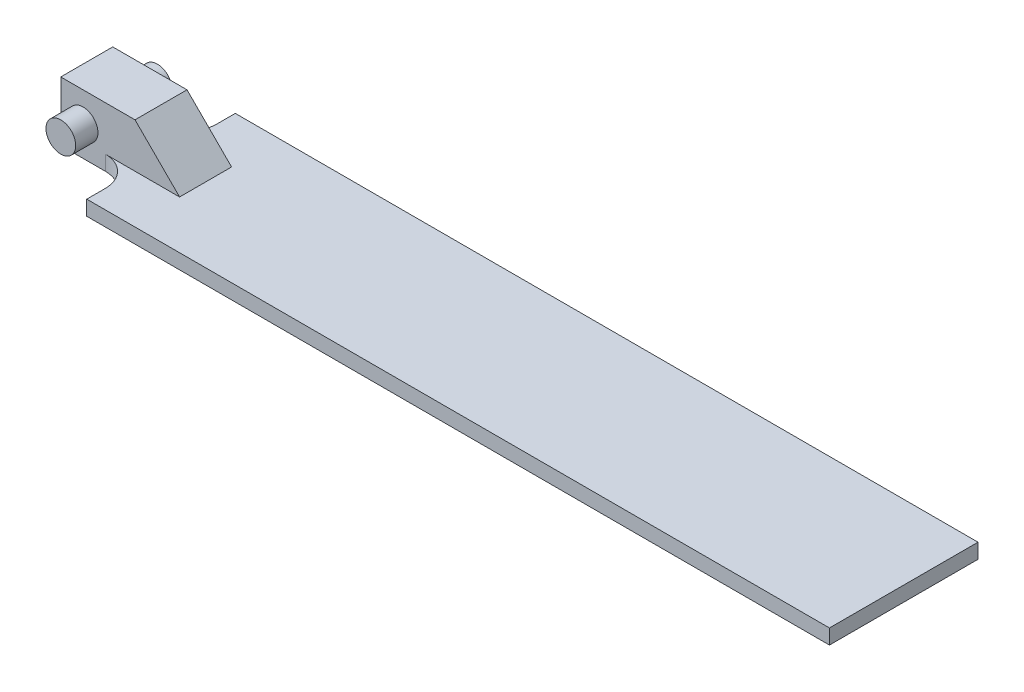
ISO-10303-21;
HEADER;
FILE_DESCRIPTION(('STEP AP214'),'2;1');
FILE_NAME('part.step','',(''),(''),'','','');
FILE_SCHEMA(('AUTOMOTIVE_DESIGN { 1 0 10303 214 1 1 1 1 }'));
ENDSEC;
DATA;
#1=APPLICATION_CONTEXT('core data for automotive mechanical design processes');
#2=APPLICATION_PROTOCOL_DEFINITION('international standard','automotive_design',2000,#1);
#3=PRODUCT_CONTEXT('',#1,'mechanical');
#4=PRODUCT('Part','Part','',(#3));
#5=PRODUCT_RELATED_PRODUCT_CATEGORY('part','',(#4));
#6=PRODUCT_DEFINITION_FORMATION('','',#4);
#7=PRODUCT_DEFINITION_CONTEXT('part definition',#1,'design');
#8=PRODUCT_DEFINITION('design','',#6,#7);
#9=PRODUCT_DEFINITION_SHAPE('','',#8);
#10=(LENGTH_UNIT() NAMED_UNIT(*) SI_UNIT(.MILLI.,.METRE.));
#11=(NAMED_UNIT(*) PLANE_ANGLE_UNIT() SI_UNIT($,.RADIAN.));
#12=(NAMED_UNIT(*) SI_UNIT($,.STERADIAN.) SOLID_ANGLE_UNIT());
#13=UNCERTAINTY_MEASURE_WITH_UNIT(LENGTH_MEASURE(1.E-05),#10,'distance_accuracy_value','');
#14=(GEOMETRIC_REPRESENTATION_CONTEXT(3) GLOBAL_UNCERTAINTY_ASSIGNED_CONTEXT((#13)) GLOBAL_UNIT_ASSIGNED_CONTEXT((#10,
#11,#12)) REPRESENTATION_CONTEXT('',''));
#15=CARTESIAN_POINT('',(0.,0.,0.));
#16=DIRECTION('',(0.,0.,1.));
#17=DIRECTION('',(1.,0.,0.));
#18=AXIS2_PLACEMENT_3D('',#15,#16,#17);
#19=CARTESIAN_POINT('',(0.,8.,3.5));
#20=DIRECTION('',(1.,0.,0.));
#21=DIRECTION('',(0.,0.,-1.));
#22=AXIS2_PLACEMENT_3D('',#19,#20,#21);
#23=PLANE('',#22);
#24=DIRECTION('',(0.,0.,1.));
#25=VECTOR('',#24,1.);
#26=CARTESIAN_POINT('',(0.,0.,3.5));
#27=LINE('',#26,#25);
#28=CARTESIAN_POINT('',(0.,0.,-3.5));
#29=VERTEX_POINT('',#28);
#30=CARTESIAN_POINT('',(0.,0.,3.5));
#31=VERTEX_POINT('',#30);
#32=EDGE_CURVE('E168',#29,#31,#27,.T.);
#33=ORIENTED_EDGE('',*,*,#32,.T.);
#34=DIRECTION('',(0.,-1.,0.));
#35=VECTOR('',#34,1.);
#36=CARTESIAN_POINT('',(0.,8.,3.5));
#37=LINE('',#36,#35);
#38=CARTESIAN_POINT('',(0.,8.,3.5));
#39=VERTEX_POINT('',#38);
#40=EDGE_CURVE('E173',#39,#31,#37,.T.);
#41=ORIENTED_EDGE('',*,*,#40,.F.);
#42=DIRECTION('',(0.,0.,1.));
#43=VECTOR('',#42,1.);
#44=CARTESIAN_POINT('',(0.,8.,3.5));
#45=LINE('',#44,#43);
#46=CARTESIAN_POINT('',(0.,8.,-3.5));
#47=VERTEX_POINT('',#46);
#48=EDGE_CURVE('E174',#47,#39,#45,.T.);
#49=ORIENTED_EDGE('',*,*,#48,.F.);
#50=DIRECTION('',(0.,-1.,0.));
#51=VECTOR('',#50,1.);
#52=CARTESIAN_POINT('',(0.,8.,-3.5));
#53=LINE('',#52,#51);
#54=EDGE_CURVE('E185',#47,#29,#53,.T.);
#55=ORIENTED_EDGE('',*,*,#54,.T.);
#56=EDGE_LOOP('',(#33,#41,#49,#55));
#57=FACE_BOUND('',#56,.T.);
#58=ADVANCED_FACE('F41',(#57),#23,.F.);
#59=CARTESIAN_POINT('',(0.,8.,3.5));
#60=DIRECTION('',(0.,0.,-1.));
#61=DIRECTION('',(-1.,0.,0.));
#62=AXIS2_PLACEMENT_3D('',#59,#60,#61);
#63=PLANE('',#62);
#64=CARTESIAN_POINT('',(3.01,4.,3.5));
#65=DIRECTION('',(0.,0.,1.));
#66=DIRECTION('',(1.,0.,0.));
#67=AXIS2_PLACEMENT_3D('',#64,#65,#66);
#68=CIRCLE('',#67,2.);
#69=CARTESIAN_POINT('',(5.01,4.,3.5));
#70=VERTEX_POINT('',#69);
#71=EDGE_CURVE('E169',#70,#70,#68,.T.);
#72=ORIENTED_EDGE('',*,*,#71,.F.);
#73=EDGE_LOOP('',(#72));
#74=FACE_BOUND('',#73,.T.);
#75=DIRECTION('',(1.,0.,0.));
#76=VECTOR('',#75,1.);
#77=CARTESIAN_POINT('',(0.,0.,3.5));
#78=LINE('',#77,#76);
#79=CARTESIAN_POINT('',(6.,0.,3.5));
#80=VERTEX_POINT('',#79);
#81=EDGE_CURVE('E188',#31,#80,#78,.T.);
#82=ORIENTED_EDGE('',*,*,#81,.T.);
#83=DIRECTION('',(0.,-1.,0.));
#84=VECTOR('',#83,1.);
#85=CARTESIAN_POINT('',(6.,8.,3.5));
#86=LINE('',#85,#84);
#87=CARTESIAN_POINT('',(6.,2.,3.5));
#88=VERTEX_POINT('',#87);
#89=EDGE_CURVE('E212',#80,#88,#86,.F.);
#90=ORIENTED_EDGE('',*,*,#89,.T.);
#91=DIRECTION('',(-1.,0.,0.));
#92=VECTOR('',#91,1.);
#93=CARTESIAN_POINT('',(0.,2.,3.5));
#94=LINE('',#93,#92);
#95=CARTESIAN_POINT('',(16.0000000000001,2.,3.49999999999999));
#96=VERTEX_POINT('',#95);
#97=EDGE_CURVE('E55',#96,#88,#94,.T.);
#98=ORIENTED_EDGE('',*,*,#97,.F.);
#99=DIRECTION('',(0.707106781186551,-0.707106781186544,0.));
#100=VECTOR('',#99,1.);
#101=CARTESIAN_POINT('',(4.99999999999995,13.,3.5));
#102=LINE('',#101,#100);
#103=CARTESIAN_POINT('',(10.,8.,3.5));
#104=VERTEX_POINT('',#103);
#105=EDGE_CURVE('E200',#96,#104,#102,.F.);
#106=ORIENTED_EDGE('',*,*,#105,.T.);
#107=DIRECTION('',(1.,0.,0.));
#108=VECTOR('',#107,1.);
#109=CARTESIAN_POINT('',(0.,8.,3.5));
#110=LINE('',#109,#108);
#111=EDGE_CURVE('E177',#39,#104,#110,.T.);
#112=ORIENTED_EDGE('',*,*,#111,.F.);
#113=ORIENTED_EDGE('',*,*,#40,.T.);
#114=EDGE_LOOP('',(#82,#90,#98,#106,#112,#113));
#115=FACE_BOUND('',#114,.T.);
#116=ADVANCED_FACE('F243',(#74,#115),#63,.F.);
#117=CARTESIAN_POINT('',(0.,8.,-3.5));
#118=DIRECTION('',(0.,0.,1.));
#119=DIRECTION('',(1.,0.,0.));
#120=AXIS2_PLACEMENT_3D('',#117,#118,#119);
#121=PLANE('',#120);
#122=CARTESIAN_POINT('',(3.01,4.,-3.5));
#123=DIRECTION('',(0.,0.,1.));
#124=DIRECTION('',(1.,0.,0.));
#125=AXIS2_PLACEMENT_3D('',#122,#123,#124);
#126=CIRCLE('',#125,2.);
#127=CARTESIAN_POINT('',(5.01,4.,-3.5));
#128=VERTEX_POINT('',#127);
#129=EDGE_CURVE('E154',#128,#128,#126,.T.);
#130=ORIENTED_EDGE('',*,*,#129,.T.);
#131=EDGE_LOOP('',(#130));
#132=FACE_BOUND('',#131,.T.);
#133=DIRECTION('',(1.,0.,0.));
#134=VECTOR('',#133,1.);
#135=CARTESIAN_POINT('',(0.,2.,-3.5));
#136=LINE('',#135,#134);
#137=CARTESIAN_POINT('',(6.,2.,-3.5));
#138=VERTEX_POINT('',#137);
#139=CARTESIAN_POINT('',(16.0000000000001,2.,-3.5));
#140=VERTEX_POINT('',#139);
#141=EDGE_CURVE('E172',#138,#140,#136,.T.);
#142=ORIENTED_EDGE('',*,*,#141,.F.);
#143=DIRECTION('',(0.,-1.,0.));
#144=VECTOR('',#143,1.);
#145=CARTESIAN_POINT('',(6.,8.,-3.5));
#146=LINE('',#145,#144);
#147=CARTESIAN_POINT('',(6.,0.,-3.5));
#148=VERTEX_POINT('',#147);
#149=EDGE_CURVE('E204',#138,#148,#146,.T.);
#150=ORIENTED_EDGE('',*,*,#149,.T.);
#151=DIRECTION('',(-1.,0.,0.));
#152=VECTOR('',#151,1.);
#153=CARTESIAN_POINT('',(0.,0.,-3.5));
#154=LINE('',#153,#152);
#155=EDGE_CURVE('E178',#148,#29,#154,.T.);
#156=ORIENTED_EDGE('',*,*,#155,.T.);
#157=ORIENTED_EDGE('',*,*,#54,.F.);
#158=DIRECTION('',(-1.,0.,0.));
#159=VECTOR('',#158,1.);
#160=CARTESIAN_POINT('',(0.,8.,-3.5));
#161=LINE('',#160,#159);
#162=CARTESIAN_POINT('',(10.,8.,-3.5));
#163=VERTEX_POINT('',#162);
#164=EDGE_CURVE('E183',#163,#47,#161,.T.);
#165=ORIENTED_EDGE('',*,*,#164,.F.);
#166=DIRECTION('',(-0.707106781186551,0.707106781186544,0.));
#167=VECTOR('',#166,1.);
#168=CARTESIAN_POINT('',(4.99999999999995,13.,-3.5));
#169=LINE('',#168,#167);
#170=EDGE_CURVE('E202',#163,#140,#169,.F.);
#171=ORIENTED_EDGE('',*,*,#170,.T.);
#172=EDGE_LOOP('',(#142,#150,#156,#157,#165,#171));
#173=FACE_BOUND('',#172,.T.);
#174=ADVANCED_FACE('F230',(#132,#173),#121,.F.);
#175=CARTESIAN_POINT('',(0.,8.,0.));
#176=DIRECTION('',(0.,-1.,0.));
#177=DIRECTION('',(0.,0.,-1.));
#178=AXIS2_PLACEMENT_3D('',#175,#176,#177);
#179=PLANE('',#178);
#180=ORIENTED_EDGE('',*,*,#48,.T.);
#181=ORIENTED_EDGE('',*,*,#111,.T.);
#182=DIRECTION('',(0.,0.,-1.));
#183=VECTOR('',#182,1.);
#184=CARTESIAN_POINT('',(10.,8.,3.5));
#185=LINE('',#184,#183);
#186=EDGE_CURVE('E181',#104,#163,#185,.T.);
#187=ORIENTED_EDGE('',*,*,#186,.T.);
#188=ORIENTED_EDGE('',*,*,#164,.T.);
#189=EDGE_LOOP('',(#180,#181,#187,#188));
#190=FACE_BOUND('',#189,.T.);
#191=ADVANCED_FACE('F343',(#190),#179,.F.);
#192=CARTESIAN_POINT('',(0.,0.,0.));
#193=DIRECTION('',(0.,-1.,0.));
#194=DIRECTION('',(0.,0.,-1.));
#195=AXIS2_PLACEMENT_3D('',#192,#193,#194);
#196=PLANE('',#195);
#197=ORIENTED_EDGE('',*,*,#32,.F.);
#198=ORIENTED_EDGE('',*,*,#155,.F.);
#199=CARTESIAN_POINT('',(6.,0.,-7.5));
#200=DIRECTION('',(0.,-1.,0.));
#201=DIRECTION('',(0.,0.,-1.));
#202=AXIS2_PLACEMENT_3D('',#199,#200,#201);
#203=CIRCLE('',#202,4.);
#204=CARTESIAN_POINT('',(10.,0.,-7.5));
#205=VERTEX_POINT('',#204);
#206=EDGE_CURVE('E214',#148,#205,#203,.F.);
#207=ORIENTED_EDGE('',*,*,#206,.T.);
#208=DIRECTION('',(0.,0.,-1.));
#209=VECTOR('',#208,1.);
#210=CARTESIAN_POINT('',(10.,0.,10.));
#211=LINE('',#210,#209);
#212=CARTESIAN_POINT('',(10.,0.,-10.));
#213=VERTEX_POINT('',#212);
#214=EDGE_CURVE('E264',#205,#213,#211,.T.);
#215=ORIENTED_EDGE('',*,*,#214,.T.);
#216=DIRECTION('',(-1.,0.,0.));
#217=VECTOR('',#216,1.);
#218=CARTESIAN_POINT('',(110.,0.,-10.));
#219=LINE('',#218,#217);
#220=CARTESIAN_POINT('',(110.,0.,-10.));
#221=VERTEX_POINT('',#220);
#222=EDGE_CURVE('E136',#221,#213,#219,.T.);
#223=ORIENTED_EDGE('',*,*,#222,.F.);
#224=DIRECTION('',(0.,0.,-1.));
#225=VECTOR('',#224,1.);
#226=CARTESIAN_POINT('',(110.,0.,10.));
#227=LINE('',#226,#225);
#228=CARTESIAN_POINT('',(110.,0.,10.));
#229=VERTEX_POINT('',#228);
#230=EDGE_CURVE('E128',#229,#221,#227,.T.);
#231=ORIENTED_EDGE('',*,*,#230,.F.);
#232=DIRECTION('',(-1.,0.,0.));
#233=VECTOR('',#232,1.);
#234=CARTESIAN_POINT('',(110.,0.,10.));
#235=LINE('',#234,#233);
#236=CARTESIAN_POINT('',(10.,0.,10.));
#237=VERTEX_POINT('',#236);
#238=EDGE_CURVE('E133',#229,#237,#235,.T.);
#239=ORIENTED_EDGE('',*,*,#238,.T.);
#240=CARTESIAN_POINT('',(10.,0.,7.5));
#241=VERTEX_POINT('',#240);
#242=EDGE_CURVE('E254',#237,#241,#211,.T.);
#243=ORIENTED_EDGE('',*,*,#242,.T.);
#244=CARTESIAN_POINT('',(6.,0.,7.5));
#245=DIRECTION('',(0.,-1.,0.));
#246=DIRECTION('',(0.,0.,-1.));
#247=AXIS2_PLACEMENT_3D('',#244,#245,#246);
#248=CIRCLE('',#247,4.);
#249=EDGE_CURVE('E49',#241,#80,#248,.F.);
#250=ORIENTED_EDGE('',*,*,#249,.T.);
#251=ORIENTED_EDGE('',*,*,#81,.F.);
#252=EDGE_LOOP('',(#197,#198,#207,#215,#223,#231,#239,#243,#250,#251));
#253=FACE_BOUND('',#252,.T.);
#254=ADVANCED_FACE('F131',(#253),#196,.T.);
#255=CARTESIAN_POINT('',(3.01,4.,6.5));
#256=DIRECTION('',(0.,0.,-1.));
#257=DIRECTION('',(-1.,0.,0.));
#258=AXIS2_PLACEMENT_3D('',#255,#256,#257);
#259=CYLINDRICAL_SURFACE('',#258,2.);
#260=CARTESIAN_POINT('',(3.01,4.,6.5));
#261=DIRECTION('',(0.,0.,1.));
#262=DIRECTION('',(1.,0.,0.));
#263=AXIS2_PLACEMENT_3D('',#260,#261,#262);
#264=CIRCLE('',#263,2.);
#265=CARTESIAN_POINT('',(5.01,4.,6.5));
#266=VERTEX_POINT('',#265);
#267=EDGE_CURVE('E164',#266,#266,#264,.T.);
#268=ORIENTED_EDGE('',*,*,#267,.F.);
#269=EDGE_LOOP('',(#268));
#270=FACE_BOUND('',#269,.T.);
#271=ORIENTED_EDGE('',*,*,#71,.T.);
#272=EDGE_LOOP('',(#271));
#273=FACE_BOUND('',#272,.T.);
#274=ADVANCED_FACE('F342',(#270,#273),#259,.T.);
#275=CARTESIAN_POINT('',(3.01,4.,6.5));
#276=DIRECTION('',(0.,0.,1.));
#277=DIRECTION('',(1.,0.,0.));
#278=AXIS2_PLACEMENT_3D('',#275,#276,#277);
#279=PLANE('',#278);
#280=ORIENTED_EDGE('',*,*,#267,.T.);
#281=EDGE_LOOP('',(#280));
#282=FACE_BOUND('',#281,.T.);
#283=ADVANCED_FACE('F413',(#282),#279,.T.);
#284=CARTESIAN_POINT('',(3.01,4.,-6.5));
#285=DIRECTION('',(0.,0.,1.));
#286=DIRECTION('',(1.,0.,0.));
#287=AXIS2_PLACEMENT_3D('',#284,#285,#286);
#288=CYLINDRICAL_SURFACE('',#287,2.);
#289=CARTESIAN_POINT('',(3.01,4.,-6.5));
#290=DIRECTION('',(0.,0.,1.));
#291=DIRECTION('',(1.,0.,0.));
#292=AXIS2_PLACEMENT_3D('',#289,#290,#291);
#293=CIRCLE('',#292,2.);
#294=CARTESIAN_POINT('',(5.01,4.,-6.5));
#295=VERTEX_POINT('',#294);
#296=EDGE_CURVE('E157',#295,#295,#293,.T.);
#297=ORIENTED_EDGE('',*,*,#296,.T.);
#298=EDGE_LOOP('',(#297));
#299=FACE_BOUND('',#298,.T.);
#300=ORIENTED_EDGE('',*,*,#129,.F.);
#301=EDGE_LOOP('',(#300));
#302=FACE_BOUND('',#301,.T.);
#303=ADVANCED_FACE('F402',(#299,#302),#288,.T.);
#304=CARTESIAN_POINT('',(3.01,4.,-6.5));
#305=DIRECTION('',(0.,0.,-1.));
#306=DIRECTION('',(1.,0.,0.));
#307=AXIS2_PLACEMENT_3D('',#304,#305,#306);
#308=PLANE('',#307);
#309=ORIENTED_EDGE('',*,*,#296,.F.);
#310=EDGE_LOOP('',(#309));
#311=FACE_BOUND('',#310,.T.);
#312=ADVANCED_FACE('F331',(#311),#308,.T.);
#313=CARTESIAN_POINT('',(10.,0.,0.));
#314=DIRECTION('',(-1.,0.,0.));
#315=DIRECTION('',(0.,0.,1.));
#316=AXIS2_PLACEMENT_3D('',#313,#314,#315);
#317=PLANE('',#316);
#318=ORIENTED_EDGE('',*,*,#214,.F.);
#319=DIRECTION('',(0.,-1.,0.));
#320=VECTOR('',#319,1.);
#321=CARTESIAN_POINT('',(10.,0.,-7.5));
#322=LINE('',#321,#320);
#323=CARTESIAN_POINT('',(10.,2.,-7.5));
#324=VERTEX_POINT('',#323);
#325=EDGE_CURVE('E207',#205,#324,#322,.F.);
#326=ORIENTED_EDGE('',*,*,#325,.T.);
#327=DIRECTION('',(0.,0.,1.));
#328=VECTOR('',#327,1.);
#329=CARTESIAN_POINT('',(10.,2.,10.));
#330=LINE('',#329,#328);
#331=CARTESIAN_POINT('',(10.,2.,-10.));
#332=VERTEX_POINT('',#331);
#333=EDGE_CURVE('E149',#332,#324,#330,.T.);
#334=ORIENTED_EDGE('',*,*,#333,.F.);
#335=DIRECTION('',(0.,1.,0.));
#336=VECTOR('',#335,1.);
#337=CARTESIAN_POINT('',(10.,0.,-10.));
#338=LINE('',#337,#336);
#339=EDGE_CURVE('E252',#213,#332,#338,.T.);
#340=ORIENTED_EDGE('',*,*,#339,.F.);
#341=EDGE_LOOP('',(#318,#326,#334,#340));
#342=FACE_BOUND('',#341,.T.);
#343=ADVANCED_FACE('F263',(#342),#317,.T.);
#344=CARTESIAN_POINT('',(110.,0.,10.));
#345=DIRECTION('',(0.,0.,-1.));
#346=DIRECTION('',(-1.,0.,0.));
#347=AXIS2_PLACEMENT_3D('',#344,#345,#346);
#348=PLANE('',#347);
#349=DIRECTION('',(0.,-1.,0.));
#350=VECTOR('',#349,1.);
#351=CARTESIAN_POINT('',(10.,0.,10.));
#352=LINE('',#351,#350);
#353=CARTESIAN_POINT('',(10.,2.,10.));
#354=VERTEX_POINT('',#353);
#355=EDGE_CURVE('E153',#354,#237,#352,.T.);
#356=ORIENTED_EDGE('',*,*,#355,.T.);
#357=ORIENTED_EDGE('',*,*,#238,.F.);
#358=DIRECTION('',(0.,-1.,0.));
#359=VECTOR('',#358,1.);
#360=CARTESIAN_POINT('',(110.,0.,10.));
#361=LINE('',#360,#359);
#362=CARTESIAN_POINT('',(110.,2.,10.));
#363=VERTEX_POINT('',#362);
#364=EDGE_CURVE('E140',#363,#229,#361,.T.);
#365=ORIENTED_EDGE('',*,*,#364,.F.);
#366=DIRECTION('',(-1.,0.,0.));
#367=VECTOR('',#366,1.);
#368=CARTESIAN_POINT('',(110.,2.,10.));
#369=LINE('',#368,#367);
#370=EDGE_CURVE('E258',#363,#354,#369,.T.);
#371=ORIENTED_EDGE('',*,*,#370,.T.);
#372=EDGE_LOOP('',(#356,#357,#365,#371));
#373=FACE_BOUND('',#372,.T.);
#374=ADVANCED_FACE('F151',(#373),#348,.F.);
#375=CARTESIAN_POINT('',(110.,0.,-10.));
#376=DIRECTION('',(0.,0.,1.));
#377=DIRECTION('',(1.,0.,0.));
#378=AXIS2_PLACEMENT_3D('',#375,#376,#377);
#379=PLANE('',#378);
#380=ORIENTED_EDGE('',*,*,#339,.T.);
#381=DIRECTION('',(-1.,0.,0.));
#382=VECTOR('',#381,1.);
#383=CARTESIAN_POINT('',(110.,2.,-10.));
#384=LINE('',#383,#382);
#385=CARTESIAN_POINT('',(110.,2.,-10.));
#386=VERTEX_POINT('',#385);
#387=EDGE_CURVE('E159',#386,#332,#384,.T.);
#388=ORIENTED_EDGE('',*,*,#387,.F.);
#389=DIRECTION('',(0.,1.,0.));
#390=VECTOR('',#389,1.);
#391=CARTESIAN_POINT('',(110.,0.,-10.));
#392=LINE('',#391,#390);
#393=EDGE_CURVE('E139',#221,#386,#392,.T.);
#394=ORIENTED_EDGE('',*,*,#393,.F.);
#395=ORIENTED_EDGE('',*,*,#222,.T.);
#396=EDGE_LOOP('',(#380,#388,#394,#395));
#397=FACE_BOUND('',#396,.T.);
#398=ADVANCED_FACE('F268',(#397),#379,.F.);
#399=CARTESIAN_POINT('',(110.,2.,10.));
#400=DIRECTION('',(0.,-1.,0.));
#401=DIRECTION('',(0.,0.,-1.));
#402=AXIS2_PLACEMENT_3D('',#399,#400,#401);
#403=PLANE('',#402);
#404=DIRECTION('',(0.,0.,1.));
#405=VECTOR('',#404,1.);
#406=CARTESIAN_POINT('',(16.0000000000001,2.,3.49999999999999));
#407=LINE('',#406,#405);
#408=EDGE_CURVE('E197',#140,#96,#407,.T.);
#409=ORIENTED_EDGE('',*,*,#408,.T.);
#410=ORIENTED_EDGE('',*,*,#97,.T.);
#411=CARTESIAN_POINT('',(6.,2.,7.5));
#412=DIRECTION('',(0.,-1.,0.));
#413=DIRECTION('',(0.,0.,-1.));
#414=AXIS2_PLACEMENT_3D('',#411,#412,#413);
#415=CIRCLE('',#414,4.);
#416=CARTESIAN_POINT('',(10.,2.,7.5));
#417=VERTEX_POINT('',#416);
#418=EDGE_CURVE('E11',#88,#417,#415,.T.);
#419=ORIENTED_EDGE('',*,*,#418,.T.);
#420=EDGE_CURVE('E249',#417,#354,#330,.T.);
#421=ORIENTED_EDGE('',*,*,#420,.T.);
#422=ORIENTED_EDGE('',*,*,#370,.F.);
#423=DIRECTION('',(0.,0.,1.));
#424=VECTOR('',#423,1.);
#425=CARTESIAN_POINT('',(110.,2.,10.));
#426=LINE('',#425,#424);
#427=EDGE_CURVE('E145',#386,#363,#426,.T.);
#428=ORIENTED_EDGE('',*,*,#427,.F.);
#429=ORIENTED_EDGE('',*,*,#387,.T.);
#430=ORIENTED_EDGE('',*,*,#333,.T.);
#431=CARTESIAN_POINT('',(6.,2.,-7.5));
#432=DIRECTION('',(0.,-1.,0.));
#433=DIRECTION('',(0.,0.,-1.));
#434=AXIS2_PLACEMENT_3D('',#431,#432,#433);
#435=CIRCLE('',#434,4.);
#436=EDGE_CURVE('E216',#324,#138,#435,.T.);
#437=ORIENTED_EDGE('',*,*,#436,.T.);
#438=ORIENTED_EDGE('',*,*,#141,.T.);
#439=EDGE_LOOP('',(#409,#410,#419,#421,#422,#428,#429,#430,#437,#438));
#440=FACE_BOUND('',#439,.T.);
#441=ADVANCED_FACE('F221',(#440),#403,.F.);
#442=CARTESIAN_POINT('',(110.,0.,0.));
#443=DIRECTION('',(-1.,0.,0.));
#444=DIRECTION('',(0.,0.,1.));
#445=AXIS2_PLACEMENT_3D('',#442,#443,#444);
#446=PLANE('',#445);
#447=ORIENTED_EDGE('',*,*,#364,.T.);
#448=ORIENTED_EDGE('',*,*,#230,.T.);
#449=ORIENTED_EDGE('',*,*,#393,.T.);
#450=ORIENTED_EDGE('',*,*,#427,.T.);
#451=EDGE_LOOP('',(#447,#448,#449,#450));
#452=FACE_BOUND('',#451,.T.);
#453=ADVANCED_FACE('F143',(#452),#446,.F.);
#454=ORIENTED_EDGE('',*,*,#420,.F.);
#455=DIRECTION('',(0.,-1.,0.));
#456=VECTOR('',#455,1.);
#457=CARTESIAN_POINT('',(10.,0.,7.5));
#458=LINE('',#457,#456);
#459=EDGE_CURVE('E209',#417,#241,#458,.T.);
#460=ORIENTED_EDGE('',*,*,#459,.T.);
#461=ORIENTED_EDGE('',*,*,#242,.F.);
#462=ORIENTED_EDGE('',*,*,#355,.F.);
#463=EDGE_LOOP('',(#454,#460,#461,#462));
#464=FACE_BOUND('',#463,.T.);
#465=ADVANCED_FACE('F251',(#464),#317,.T.);
#466=CARTESIAN_POINT('',(16.0000000000001,2.,10.));
#467=DIRECTION('',(0.707106781186544,0.707106781186551,0.));
#468=DIRECTION('',(0.,0.,-1.));
#469=AXIS2_PLACEMENT_3D('',#466,#467,#468);
#470=PLANE('',#469);
#471=ORIENTED_EDGE('',*,*,#170,.F.);
#472=ORIENTED_EDGE('',*,*,#186,.F.);
#473=ORIENTED_EDGE('',*,*,#105,.F.);
#474=ORIENTED_EDGE('',*,*,#408,.F.);
#475=EDGE_LOOP('',(#471,#472,#473,#474));
#476=FACE_BOUND('',#475,.T.);
#477=ADVANCED_FACE('F241',(#476),#470,.T.);
#478=CARTESIAN_POINT('',(6.,8.,-7.5));
#479=DIRECTION('',(0.,-1.,0.));
#480=DIRECTION('',(0.,0.,-1.));
#481=AXIS2_PLACEMENT_3D('',#478,#479,#480);
#482=CYLINDRICAL_SURFACE('',#481,4.);
#483=ORIENTED_EDGE('',*,*,#436,.F.);
#484=ORIENTED_EDGE('',*,*,#325,.F.);
#485=ORIENTED_EDGE('',*,*,#206,.F.);
#486=ORIENTED_EDGE('',*,*,#149,.F.);
#487=EDGE_LOOP('',(#483,#484,#485,#486));
#488=FACE_BOUND('',#487,.T.);
#489=ADVANCED_FACE('F227',(#488),#482,.F.);
#490=CARTESIAN_POINT('',(6.,0.,7.5));
#491=DIRECTION('',(0.,-1.,0.));
#492=DIRECTION('',(0.,0.,-1.));
#493=AXIS2_PLACEMENT_3D('',#490,#491,#492);
#494=CYLINDRICAL_SURFACE('',#493,4.);
#495=ORIENTED_EDGE('',*,*,#418,.F.);
#496=ORIENTED_EDGE('',*,*,#89,.F.);
#497=ORIENTED_EDGE('',*,*,#249,.F.);
#498=ORIENTED_EDGE('',*,*,#459,.F.);
#499=EDGE_LOOP('',(#495,#496,#497,#498));
#500=FACE_BOUND('',#499,.T.);
#501=ADVANCED_FACE('F43',(#500),#494,.F.);
#502=CLOSED_SHELL('',(#58,#116,#174,#191,#254,#274,#283,#303,#312,#343,#374,#398,#441,#453,#465,
#477,#489,#501));
#503=MANIFOLD_SOLID_BREP('B2',#502);
#504=ADVANCED_BREP_SHAPE_REPRESENTATION('',(#18,#503),#14);
#505=SHAPE_DEFINITION_REPRESENTATION(#9,#504);
ENDSEC;
END-ISO-10303-21;
